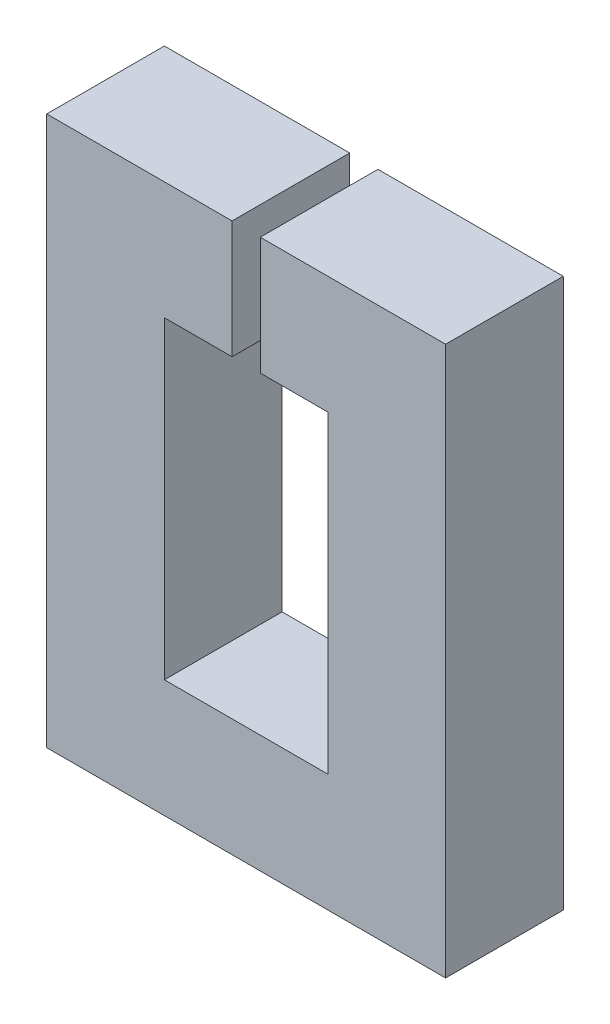
ISO-10303-21;
HEADER;
FILE_DESCRIPTION(('STEP AP214'),'2;1');
FILE_NAME('part.step','',(''),(''),'','','');
FILE_SCHEMA(('AUTOMOTIVE_DESIGN { 1 0 10303 214 1 1 1 1 }'));
ENDSEC;
DATA;
#1=APPLICATION_CONTEXT('core data for automotive mechanical design processes');
#2=APPLICATION_PROTOCOL_DEFINITION('international standard','automotive_design',2000,#1);
#3=PRODUCT_CONTEXT('',#1,'mechanical');
#4=PRODUCT('Part','Part','',(#3));
#5=PRODUCT_RELATED_PRODUCT_CATEGORY('part','',(#4));
#6=PRODUCT_DEFINITION_FORMATION('','',#4);
#7=PRODUCT_DEFINITION_CONTEXT('part definition',#1,'design');
#8=PRODUCT_DEFINITION('design','',#6,#7);
#9=PRODUCT_DEFINITION_SHAPE('','',#8);
#10=(LENGTH_UNIT() NAMED_UNIT(*) SI_UNIT(.MILLI.,.METRE.));
#11=(NAMED_UNIT(*) PLANE_ANGLE_UNIT() SI_UNIT($,.RADIAN.));
#12=(NAMED_UNIT(*) SI_UNIT($,.STERADIAN.) SOLID_ANGLE_UNIT());
#13=UNCERTAINTY_MEASURE_WITH_UNIT(LENGTH_MEASURE(1.E-05),#10,'distance_accuracy_value','');
#14=(GEOMETRIC_REPRESENTATION_CONTEXT(3) GLOBAL_UNCERTAINTY_ASSIGNED_CONTEXT((#13)) GLOBAL_UNIT_ASSIGNED_CONTEXT((#10,
#11,#12)) REPRESENTATION_CONTEXT('',''));
#15=CARTESIAN_POINT('',(0.,0.,0.));
#16=DIRECTION('',(0.,0.,1.));
#17=DIRECTION('',(1.,0.,0.));
#18=AXIS2_PLACEMENT_3D('',#15,#16,#17);
#19=CARTESIAN_POINT('',(50.85,69.975,30.));
#20=DIRECTION('',(-1.,0.,0.));
#21=DIRECTION('',(0.,-1.,0.));
#22=AXIS2_PLACEMENT_3D('',#19,#20,#21);
#23=PLANE('',#22);
#24=DIRECTION('',(0.,1.,0.));
#25=VECTOR('',#24,1.);
#26=CARTESIAN_POINT('',(50.85,69.975,0.));
#27=LINE('',#26,#25);
#28=CARTESIAN_POINT('',(50.85,-69.975,0.));
#29=VERTEX_POINT('',#28);
#30=CARTESIAN_POINT('',(50.85,69.975,0.));
#31=VERTEX_POINT('',#30);
#32=EDGE_CURVE('E159',#29,#31,#27,.T.);
#33=ORIENTED_EDGE('',*,*,#32,.T.);
#34=DIRECTION('',(0.,0.,-1.));
#35=VECTOR('',#34,1.);
#36=CARTESIAN_POINT('',(50.85,69.975,30.));
#37=LINE('',#36,#35);
#38=CARTESIAN_POINT('',(50.85,69.975,30.));
#39=VERTEX_POINT('',#38);
#40=EDGE_CURVE('E11',#39,#31,#37,.T.);
#41=ORIENTED_EDGE('',*,*,#40,.F.);
#42=DIRECTION('',(0.,1.,0.));
#43=VECTOR('',#42,1.);
#44=CARTESIAN_POINT('',(50.85,69.975,30.));
#45=LINE('',#44,#43);
#46=CARTESIAN_POINT('',(50.85,-69.975,30.));
#47=VERTEX_POINT('',#46);
#48=EDGE_CURVE('E181',#47,#39,#45,.T.);
#49=ORIENTED_EDGE('',*,*,#48,.F.);
#50=DIRECTION('',(0.,0.,-1.));
#51=VECTOR('',#50,1.);
#52=CARTESIAN_POINT('',(50.85,-69.975,30.));
#53=LINE('',#52,#51);
#54=EDGE_CURVE('E155',#47,#29,#53,.T.);
#55=ORIENTED_EDGE('',*,*,#54,.T.);
#56=EDGE_LOOP('',(#33,#41,#49,#55));
#57=FACE_BOUND('',#56,.T.);
#58=ADVANCED_FACE('F39',(#57),#23,.F.);
#59=CARTESIAN_POINT('',(3.6,69.975,30.));
#60=DIRECTION('',(0.,-1.,0.));
#61=DIRECTION('',(0.,0.,-1.));
#62=AXIS2_PLACEMENT_3D('',#59,#60,#61);
#63=PLANE('',#62);
#64=DIRECTION('',(-1.,0.,0.));
#65=VECTOR('',#64,1.);
#66=CARTESIAN_POINT('',(3.6,69.975,0.));
#67=LINE('',#66,#65);
#68=CARTESIAN_POINT('',(3.6,69.975,0.));
#69=VERTEX_POINT('',#68);
#70=EDGE_CURVE('E162',#31,#69,#67,.T.);
#71=ORIENTED_EDGE('',*,*,#70,.T.);
#72=DIRECTION('',(0.,0.,-1.));
#73=VECTOR('',#72,1.);
#74=CARTESIAN_POINT('',(3.6,69.975,30.));
#75=LINE('',#74,#73);
#76=CARTESIAN_POINT('',(3.6,69.975,30.));
#77=VERTEX_POINT('',#76);
#78=EDGE_CURVE('E47',#77,#69,#75,.T.);
#79=ORIENTED_EDGE('',*,*,#78,.F.);
#80=DIRECTION('',(-1.,0.,0.));
#81=VECTOR('',#80,1.);
#82=CARTESIAN_POINT('',(3.6,69.975,30.));
#83=LINE('',#82,#81);
#84=EDGE_CURVE('E110',#39,#77,#83,.T.);
#85=ORIENTED_EDGE('',*,*,#84,.F.);
#86=ORIENTED_EDGE('',*,*,#40,.T.);
#87=EDGE_LOOP('',(#71,#79,#85,#86));
#88=FACE_BOUND('',#87,.T.);
#89=ADVANCED_FACE('F259',(#88),#63,.F.);
#90=CARTESIAN_POINT('',(3.6,69.975,30.));
#91=DIRECTION('',(1.,0.,0.));
#92=DIRECTION('',(0.,1.,0.));
#93=AXIS2_PLACEMENT_3D('',#90,#91,#92);
#94=PLANE('',#93);
#95=DIRECTION('',(0.,-1.,0.));
#96=VECTOR('',#95,1.);
#97=CARTESIAN_POINT('',(3.6,69.975,0.));
#98=LINE('',#97,#96);
#99=CARTESIAN_POINT('',(3.6,39.975,0.));
#100=VERTEX_POINT('',#99);
#101=EDGE_CURVE('E164',#69,#100,#98,.T.);
#102=ORIENTED_EDGE('',*,*,#101,.T.);
#103=DIRECTION('',(0.,0.,-1.));
#104=VECTOR('',#103,1.);
#105=CARTESIAN_POINT('',(3.6,39.975,30.));
#106=LINE('',#105,#104);
#107=CARTESIAN_POINT('',(3.6,39.975,30.));
#108=VERTEX_POINT('',#107);
#109=EDGE_CURVE('E200',#108,#100,#106,.T.);
#110=ORIENTED_EDGE('',*,*,#109,.F.);
#111=DIRECTION('',(0.,-1.,0.));
#112=VECTOR('',#111,1.);
#113=CARTESIAN_POINT('',(3.6,69.975,30.));
#114=LINE('',#113,#112);
#115=EDGE_CURVE('E208',#77,#108,#114,.T.);
#116=ORIENTED_EDGE('',*,*,#115,.F.);
#117=ORIENTED_EDGE('',*,*,#78,.T.);
#118=EDGE_LOOP('',(#102,#110,#116,#117));
#119=FACE_BOUND('',#118,.T.);
#120=ADVANCED_FACE('F206',(#119),#94,.F.);
#121=CARTESIAN_POINT('',(3.6,39.975,30.));
#122=DIRECTION('',(0.,1.,0.));
#123=DIRECTION('',(0.,0.,1.));
#124=AXIS2_PLACEMENT_3D('',#121,#122,#123);
#125=PLANE('',#124);
#126=DIRECTION('',(1.,0.,0.));
#127=VECTOR('',#126,1.);
#128=CARTESIAN_POINT('',(3.6,39.975,0.));
#129=LINE('',#128,#127);
#130=CARTESIAN_POINT('',(20.85,39.975,0.));
#131=VERTEX_POINT('',#130);
#132=EDGE_CURVE('E166',#100,#131,#129,.T.);
#133=ORIENTED_EDGE('',*,*,#132,.T.);
#134=DIRECTION('',(0.,0.,-1.));
#135=VECTOR('',#134,1.);
#136=CARTESIAN_POINT('',(20.85,39.975,30.));
#137=LINE('',#136,#135);
#138=CARTESIAN_POINT('',(20.85,39.975,30.));
#139=VERTEX_POINT('',#138);
#140=EDGE_CURVE('E197',#139,#131,#137,.T.);
#141=ORIENTED_EDGE('',*,*,#140,.F.);
#142=DIRECTION('',(1.,0.,0.));
#143=VECTOR('',#142,1.);
#144=CARTESIAN_POINT('',(3.6,39.975,30.));
#145=LINE('',#144,#143);
#146=EDGE_CURVE('E226',#108,#139,#145,.T.);
#147=ORIENTED_EDGE('',*,*,#146,.F.);
#148=ORIENTED_EDGE('',*,*,#109,.T.);
#149=EDGE_LOOP('',(#133,#141,#147,#148));
#150=FACE_BOUND('',#149,.T.);
#151=ADVANCED_FACE('F217',(#150),#125,.F.);
#152=CARTESIAN_POINT('',(20.85,39.975,30.));
#153=DIRECTION('',(1.,0.,0.));
#154=DIRECTION('',(0.,1.,0.));
#155=AXIS2_PLACEMENT_3D('',#152,#153,#154);
#156=PLANE('',#155);
#157=DIRECTION('',(0.,-1.,0.));
#158=VECTOR('',#157,1.);
#159=CARTESIAN_POINT('',(20.85,39.975,0.));
#160=LINE('',#159,#158);
#161=CARTESIAN_POINT('',(20.85,-39.975,0.));
#162=VERTEX_POINT('',#161);
#163=EDGE_CURVE('E168',#131,#162,#160,.T.);
#164=ORIENTED_EDGE('',*,*,#163,.T.);
#165=DIRECTION('',(0.,0.,-1.));
#166=VECTOR('',#165,1.);
#167=CARTESIAN_POINT('',(20.85,-39.975,30.));
#168=LINE('',#167,#166);
#169=CARTESIAN_POINT('',(20.85,-39.975,30.));
#170=VERTEX_POINT('',#169);
#171=EDGE_CURVE('E194',#170,#162,#168,.T.);
#172=ORIENTED_EDGE('',*,*,#171,.F.);
#173=DIRECTION('',(0.,-1.,0.));
#174=VECTOR('',#173,1.);
#175=CARTESIAN_POINT('',(20.85,39.975,30.));
#176=LINE('',#175,#174);
#177=EDGE_CURVE('E223',#139,#170,#176,.T.);
#178=ORIENTED_EDGE('',*,*,#177,.F.);
#179=ORIENTED_EDGE('',*,*,#140,.T.);
#180=EDGE_LOOP('',(#164,#172,#178,#179));
#181=FACE_BOUND('',#180,.T.);
#182=ADVANCED_FACE('F221',(#181),#156,.F.);
#183=CARTESIAN_POINT('',(-20.85,-39.975,30.));
#184=DIRECTION('',(0.,-1.,0.));
#185=DIRECTION('',(1.,0.,0.));
#186=AXIS2_PLACEMENT_3D('',#183,#184,#185);
#187=PLANE('',#186);
#188=DIRECTION('',(-1.,0.,0.));
#189=VECTOR('',#188,1.);
#190=CARTESIAN_POINT('',(-20.85,-39.975,0.));
#191=LINE('',#190,#189);
#192=CARTESIAN_POINT('',(-20.85,-39.975,0.));
#193=VERTEX_POINT('',#192);
#194=EDGE_CURVE('E170',#162,#193,#191,.T.);
#195=ORIENTED_EDGE('',*,*,#194,.T.);
#196=DIRECTION('',(0.,0.,-1.));
#197=VECTOR('',#196,1.);
#198=CARTESIAN_POINT('',(-20.85,-39.975,30.));
#199=LINE('',#198,#197);
#200=CARTESIAN_POINT('',(-20.85,-39.975,30.));
#201=VERTEX_POINT('',#200);
#202=EDGE_CURVE('E191',#201,#193,#199,.T.);
#203=ORIENTED_EDGE('',*,*,#202,.F.);
#204=DIRECTION('',(-1.,0.,0.));
#205=VECTOR('',#204,1.);
#206=CARTESIAN_POINT('',(-20.85,-39.975,30.));
#207=LINE('',#206,#205);
#208=EDGE_CURVE('E225',#170,#201,#207,.T.);
#209=ORIENTED_EDGE('',*,*,#208,.F.);
#210=ORIENTED_EDGE('',*,*,#171,.T.);
#211=EDGE_LOOP('',(#195,#203,#209,#210));
#212=FACE_BOUND('',#211,.T.);
#213=ADVANCED_FACE('F272',(#212),#187,.F.);
#214=CARTESIAN_POINT('',(-20.85,39.975,30.));
#215=DIRECTION('',(-1.,0.,0.));
#216=DIRECTION('',(0.,-1.,0.));
#217=AXIS2_PLACEMENT_3D('',#214,#215,#216);
#218=PLANE('',#217);
#219=DIRECTION('',(0.,1.,0.));
#220=VECTOR('',#219,1.);
#221=CARTESIAN_POINT('',(-20.85,39.975,0.));
#222=LINE('',#221,#220);
#223=CARTESIAN_POINT('',(-20.85,39.975,0.));
#224=VERTEX_POINT('',#223);
#225=EDGE_CURVE('E172',#193,#224,#222,.T.);
#226=ORIENTED_EDGE('',*,*,#225,.T.);
#227=DIRECTION('',(0.,0.,-1.));
#228=VECTOR('',#227,1.);
#229=CARTESIAN_POINT('',(-20.85,39.975,30.));
#230=LINE('',#229,#228);
#231=CARTESIAN_POINT('',(-20.85,39.975,30.));
#232=VERTEX_POINT('',#231);
#233=EDGE_CURVE('E188',#232,#224,#230,.T.);
#234=ORIENTED_EDGE('',*,*,#233,.F.);
#235=DIRECTION('',(0.,1.,0.));
#236=VECTOR('',#235,1.);
#237=CARTESIAN_POINT('',(-20.85,39.975,30.));
#238=LINE('',#237,#236);
#239=EDGE_CURVE('E228',#201,#232,#238,.T.);
#240=ORIENTED_EDGE('',*,*,#239,.F.);
#241=ORIENTED_EDGE('',*,*,#202,.T.);
#242=EDGE_LOOP('',(#226,#234,#240,#241));
#243=FACE_BOUND('',#242,.T.);
#244=ADVANCED_FACE('F275',(#243),#218,.F.);
#245=CARTESIAN_POINT('',(-20.85,39.975,30.));
#246=DIRECTION('',(0.,1.,0.));
#247=DIRECTION('',(0.,0.,1.));
#248=AXIS2_PLACEMENT_3D('',#245,#246,#247);
#249=PLANE('',#248);
#250=DIRECTION('',(1.,0.,0.));
#251=VECTOR('',#250,1.);
#252=CARTESIAN_POINT('',(-20.85,39.975,0.));
#253=LINE('',#252,#251);
#254=CARTESIAN_POINT('',(-3.6,39.975,0.));
#255=VERTEX_POINT('',#254);
#256=EDGE_CURVE('E174',#224,#255,#253,.T.);
#257=ORIENTED_EDGE('',*,*,#256,.T.);
#258=DIRECTION('',(0.,0.,-1.));
#259=VECTOR('',#258,1.);
#260=CARTESIAN_POINT('',(-3.6,39.975,30.));
#261=LINE('',#260,#259);
#262=CARTESIAN_POINT('',(-3.6,39.975,30.));
#263=VERTEX_POINT('',#262);
#264=EDGE_CURVE('E185',#263,#255,#261,.T.);
#265=ORIENTED_EDGE('',*,*,#264,.F.);
#266=DIRECTION('',(1.,0.,0.));
#267=VECTOR('',#266,1.);
#268=CARTESIAN_POINT('',(-20.85,39.975,30.));
#269=LINE('',#268,#267);
#270=EDGE_CURVE('E234',#232,#263,#269,.T.);
#271=ORIENTED_EDGE('',*,*,#270,.F.);
#272=ORIENTED_EDGE('',*,*,#233,.T.);
#273=EDGE_LOOP('',(#257,#265,#271,#272));
#274=FACE_BOUND('',#273,.T.);
#275=ADVANCED_FACE('F240',(#274),#249,.F.);
#276=CARTESIAN_POINT('',(-3.6,69.975,30.));
#277=DIRECTION('',(-1.,0.,0.));
#278=DIRECTION('',(0.,-1.,0.));
#279=AXIS2_PLACEMENT_3D('',#276,#277,#278);
#280=PLANE('',#279);
#281=DIRECTION('',(0.,1.,0.));
#282=VECTOR('',#281,1.);
#283=CARTESIAN_POINT('',(-3.6,69.975,0.));
#284=LINE('',#283,#282);
#285=CARTESIAN_POINT('',(-3.6,69.975,0.));
#286=VERTEX_POINT('',#285);
#287=EDGE_CURVE('E176',#255,#286,#284,.T.);
#288=ORIENTED_EDGE('',*,*,#287,.T.);
#289=DIRECTION('',(0.,0.,-1.));
#290=VECTOR('',#289,1.);
#291=CARTESIAN_POINT('',(-3.6,69.975,30.));
#292=LINE('',#291,#290);
#293=CARTESIAN_POINT('',(-3.6,69.975,30.));
#294=VERTEX_POINT('',#293);
#295=EDGE_CURVE('E150',#294,#286,#292,.T.);
#296=ORIENTED_EDGE('',*,*,#295,.F.);
#297=DIRECTION('',(0.,1.,0.));
#298=VECTOR('',#297,1.);
#299=CARTESIAN_POINT('',(-3.6,69.975,30.));
#300=LINE('',#299,#298);
#301=EDGE_CURVE('E141',#263,#294,#300,.T.);
#302=ORIENTED_EDGE('',*,*,#301,.F.);
#303=ORIENTED_EDGE('',*,*,#264,.T.);
#304=EDGE_LOOP('',(#288,#296,#302,#303));
#305=FACE_BOUND('',#304,.T.);
#306=ADVANCED_FACE('F244',(#305),#280,.F.);
#307=CARTESIAN_POINT('',(-50.85,69.975,30.));
#308=DIRECTION('',(0.,-1.,0.));
#309=DIRECTION('',(0.,0.,-1.));
#310=AXIS2_PLACEMENT_3D('',#307,#308,#309);
#311=PLANE('',#310);
#312=DIRECTION('',(-1.,0.,0.));
#313=VECTOR('',#312,1.);
#314=CARTESIAN_POINT('',(-50.85,69.975,0.));
#315=LINE('',#314,#313);
#316=CARTESIAN_POINT('',(-50.85,69.975,0.));
#317=VERTEX_POINT('',#316);
#318=EDGE_CURVE('E149',#286,#317,#315,.T.);
#319=ORIENTED_EDGE('',*,*,#318,.T.);
#320=DIRECTION('',(0.,0.,-1.));
#321=VECTOR('',#320,1.);
#322=CARTESIAN_POINT('',(-50.85,69.975,30.));
#323=LINE('',#322,#321);
#324=CARTESIAN_POINT('',(-50.85,69.975,30.));
#325=VERTEX_POINT('',#324);
#326=EDGE_CURVE('E146',#325,#317,#323,.T.);
#327=ORIENTED_EDGE('',*,*,#326,.F.);
#328=DIRECTION('',(-1.,0.,0.));
#329=VECTOR('',#328,1.);
#330=CARTESIAN_POINT('',(-50.85,69.975,30.));
#331=LINE('',#330,#329);
#332=EDGE_CURVE('E135',#294,#325,#331,.T.);
#333=ORIENTED_EDGE('',*,*,#332,.F.);
#334=ORIENTED_EDGE('',*,*,#295,.T.);
#335=EDGE_LOOP('',(#319,#327,#333,#334));
#336=FACE_BOUND('',#335,.T.);
#337=ADVANCED_FACE('F147',(#336),#311,.F.);
#338=CARTESIAN_POINT('',(-50.85,69.975,30.));
#339=DIRECTION('',(1.,0.,0.));
#340=DIRECTION('',(0.,1.,0.));
#341=AXIS2_PLACEMENT_3D('',#338,#339,#340);
#342=PLANE('',#341);
#343=DIRECTION('',(0.,-1.,0.));
#344=VECTOR('',#343,1.);
#345=CARTESIAN_POINT('',(-50.85,69.975,0.));
#346=LINE('',#345,#344);
#347=CARTESIAN_POINT('',(-50.85,-69.975,0.));
#348=VERTEX_POINT('',#347);
#349=EDGE_CURVE('E96',#317,#348,#346,.T.);
#350=ORIENTED_EDGE('',*,*,#349,.T.);
#351=DIRECTION('',(0.,0.,-1.));
#352=VECTOR('',#351,1.);
#353=CARTESIAN_POINT('',(-50.85,-69.975,30.));
#354=LINE('',#353,#352);
#355=CARTESIAN_POINT('',(-50.85,-69.975,30.));
#356=VERTEX_POINT('',#355);
#357=EDGE_CURVE('E151',#356,#348,#354,.T.);
#358=ORIENTED_EDGE('',*,*,#357,.F.);
#359=DIRECTION('',(0.,-1.,0.));
#360=VECTOR('',#359,1.);
#361=CARTESIAN_POINT('',(-50.85,69.975,30.));
#362=LINE('',#361,#360);
#363=EDGE_CURVE('E139',#325,#356,#362,.T.);
#364=ORIENTED_EDGE('',*,*,#363,.F.);
#365=ORIENTED_EDGE('',*,*,#326,.T.);
#366=EDGE_LOOP('',(#350,#358,#364,#365));
#367=FACE_BOUND('',#366,.T.);
#368=ADVANCED_FACE('F153',(#367),#342,.F.);
#369=CARTESIAN_POINT('',(-50.85,-69.975,30.));
#370=DIRECTION('',(0.,1.,0.));
#371=DIRECTION('',(0.,0.,1.));
#372=AXIS2_PLACEMENT_3D('',#369,#370,#371);
#373=PLANE('',#372);
#374=DIRECTION('',(1.,0.,0.));
#375=VECTOR('',#374,1.);
#376=CARTESIAN_POINT('',(-50.85,-69.975,0.));
#377=LINE('',#376,#375);
#378=EDGE_CURVE('E102',#348,#29,#377,.T.);
#379=ORIENTED_EDGE('',*,*,#378,.T.);
#380=ORIENTED_EDGE('',*,*,#54,.F.);
#381=DIRECTION('',(1.,0.,0.));
#382=VECTOR('',#381,1.);
#383=CARTESIAN_POINT('',(-50.85,-69.975,30.));
#384=LINE('',#383,#382);
#385=EDGE_CURVE('E55',#356,#47,#384,.T.);
#386=ORIENTED_EDGE('',*,*,#385,.F.);
#387=ORIENTED_EDGE('',*,*,#357,.T.);
#388=EDGE_LOOP('',(#379,#380,#386,#387));
#389=FACE_BOUND('',#388,.T.);
#390=ADVANCED_FACE('F248',(#389),#373,.F.);
#391=CARTESIAN_POINT('',(0.,0.,30.));
#392=DIRECTION('',(0.,0.,1.));
#393=DIRECTION('',(1.,0.,0.));
#394=AXIS2_PLACEMENT_3D('',#391,#392,#393);
#395=PLANE('',#394);
#396=ORIENTED_EDGE('',*,*,#48,.T.);
#397=ORIENTED_EDGE('',*,*,#84,.T.);
#398=ORIENTED_EDGE('',*,*,#115,.T.);
#399=ORIENTED_EDGE('',*,*,#146,.T.);
#400=ORIENTED_EDGE('',*,*,#177,.T.);
#401=ORIENTED_EDGE('',*,*,#208,.T.);
#402=ORIENTED_EDGE('',*,*,#239,.T.);
#403=ORIENTED_EDGE('',*,*,#270,.T.);
#404=ORIENTED_EDGE('',*,*,#301,.T.);
#405=ORIENTED_EDGE('',*,*,#332,.T.);
#406=ORIENTED_EDGE('',*,*,#363,.T.);
#407=ORIENTED_EDGE('',*,*,#385,.T.);
#408=EDGE_LOOP('',(#396,#397,#398,#399,#400,#401,#402,#403,#404,#405,#406,#407));
#409=FACE_BOUND('',#408,.T.);
#410=ADVANCED_FACE('F137',(#409),#395,.T.);
#411=CARTESIAN_POINT('',(0.,0.,0.));
#412=DIRECTION('',(0.,0.,1.));
#413=DIRECTION('',(1.,0.,0.));
#414=AXIS2_PLACEMENT_3D('',#411,#412,#413);
#415=PLANE('',#414);
#416=ORIENTED_EDGE('',*,*,#32,.F.);
#417=ORIENTED_EDGE('',*,*,#378,.F.);
#418=ORIENTED_EDGE('',*,*,#349,.F.);
#419=ORIENTED_EDGE('',*,*,#318,.F.);
#420=ORIENTED_EDGE('',*,*,#287,.F.);
#421=ORIENTED_EDGE('',*,*,#256,.F.);
#422=ORIENTED_EDGE('',*,*,#225,.F.);
#423=ORIENTED_EDGE('',*,*,#194,.F.);
#424=ORIENTED_EDGE('',*,*,#163,.F.);
#425=ORIENTED_EDGE('',*,*,#132,.F.);
#426=ORIENTED_EDGE('',*,*,#101,.F.);
#427=ORIENTED_EDGE('',*,*,#70,.F.);
#428=EDGE_LOOP('',(#416,#417,#418,#419,#420,#421,#422,#423,#424,#425,#426,#427));
#429=FACE_BOUND('',#428,.T.);
#430=ADVANCED_FACE('F212',(#429),#415,.F.);
#431=CLOSED_SHELL('',(#58,#89,#120,#151,#182,#213,#244,#275,#306,#337,#368,#390,#410,#430));
#432=MANIFOLD_SOLID_BREP('B2',#431);
#433=ADVANCED_BREP_SHAPE_REPRESENTATION('',(#18,#432),#14);
#434=SHAPE_DEFINITION_REPRESENTATION(#9,#433);
ENDSEC;
END-ISO-10303-21;
